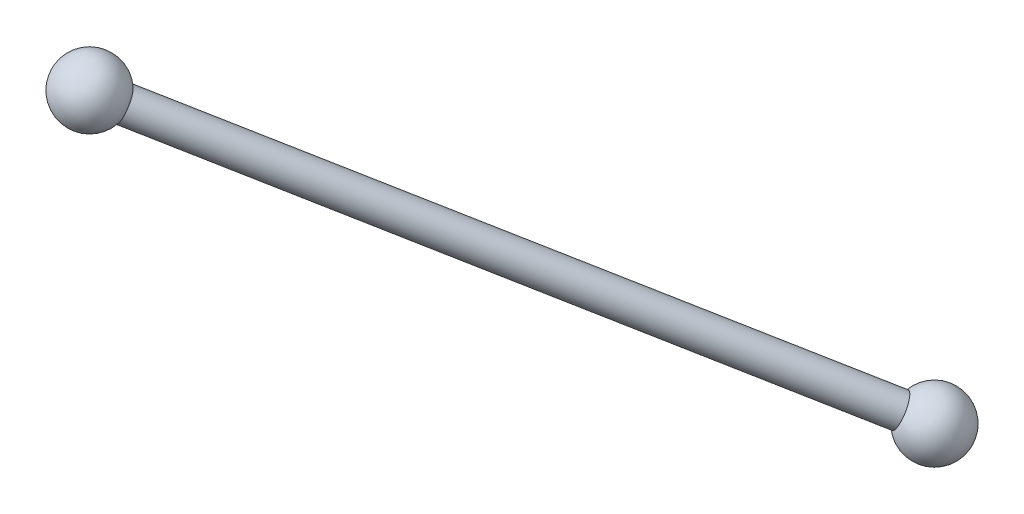
ISO-10303-21;
HEADER;
FILE_DESCRIPTION(('STEP AP214'),'2;1');
FILE_NAME('part.step','',(''),(''),'','','');
FILE_SCHEMA(('AUTOMOTIVE_DESIGN { 1 0 10303 214 1 1 1 1 }'));
ENDSEC;
DATA;
#1=APPLICATION_CONTEXT('core data for automotive mechanical design processes');
#2=APPLICATION_PROTOCOL_DEFINITION('international standard','automotive_design',2000,#1);
#3=PRODUCT_CONTEXT('',#1,'mechanical');
#4=PRODUCT('Part','Part','',(#3));
#5=PRODUCT_RELATED_PRODUCT_CATEGORY('part','',(#4));
#6=PRODUCT_DEFINITION_FORMATION('','',#4);
#7=PRODUCT_DEFINITION_CONTEXT('part definition',#1,'design');
#8=PRODUCT_DEFINITION('design','',#6,#7);
#9=PRODUCT_DEFINITION_SHAPE('','',#8);
#10=(LENGTH_UNIT() NAMED_UNIT(*) SI_UNIT(.MILLI.,.METRE.));
#11=(NAMED_UNIT(*) PLANE_ANGLE_UNIT() SI_UNIT($,.RADIAN.));
#12=(NAMED_UNIT(*) SI_UNIT($,.STERADIAN.) SOLID_ANGLE_UNIT());
#13=UNCERTAINTY_MEASURE_WITH_UNIT(LENGTH_MEASURE(1.E-05),#10,'distance_accuracy_value','');
#14=(GEOMETRIC_REPRESENTATION_CONTEXT(3) GLOBAL_UNCERTAINTY_ASSIGNED_CONTEXT((#13)) GLOBAL_UNIT_ASSIGNED_CONTEXT((#10,
#11,#12)) REPRESENTATION_CONTEXT('',''));
#15=CARTESIAN_POINT('',(0.,0.,0.));
#16=DIRECTION('',(0.,0.,1.));
#17=DIRECTION('',(1.,0.,0.));
#18=AXIS2_PLACEMENT_3D('',#15,#16,#17);
#19=CARTESIAN_POINT('',(-30.3108891325715,-101.00000000034,-14.9999999998891));
#20=DIRECTION('',(0.,0.,-1.));
#21=DIRECTION('',(-1.,0.,0.));
#22=AXIS2_PLACEMENT_3D('',#19,#20,#21);
#23=SPHERICAL_SURFACE('',#22,3.);
#24=CARTESIAN_POINT('',(-30.3108891325715,-101.00000000034,-14.9999999998891));
#25=DIRECTION('',(0.63669384291445,-0.435019425760953,-0.636693842914662));
#26=DIRECTION('',(-0.707106781186665,0.,-0.70710678118643));
#27=AXIS2_PLACEMENT_3D('',#24,#25,#26);
#28=SPHERICAL_SURFACE('',#27,3.);
#29=CARTESIAN_POINT('',(-31.9650682597627,-99.8697863787939,-13.3458208726975));
#30=DIRECTION('',(0.636693842914451,-0.435019425760953,-0.636693842914663));
#31=DIRECTION('',(-0.707106781186665,0.,-0.70710678118643));
#32=AXIS2_PLACEMENT_3D('',#29,#30,#31);
#33=CIRCLE('',#32,1.50000000000001);
#34=CARTESIAN_POINT('',(-33.0257284315427,-99.8697863787939,-14.4064810444771));
#35=VERTEX_POINT('',#34);
#36=EDGE_CURVE('E43',#35,#35,#33,.F.);
#37=ORIENTED_EDGE('',*,*,#36,.F.);
#38=EDGE_LOOP('',(#37));
#39=FACE_BOUND('',#38,.T.);
#40=ADVANCED_FACE('F39',(#39),#28,.T.);
#41=CARTESIAN_POINT('',(-71.29165124598,-73.,25.980762113533));
#42=DIRECTION('',(0.,0.,-1.));
#43=DIRECTION('',(-1.,0.,0.));
#44=AXIS2_PLACEMENT_3D('',#41,#42,#43);
#45=SPHERICAL_SURFACE('',#44,3.);
#46=CARTESIAN_POINT('',(-71.29165124598,-73.,25.980762113533));
#47=DIRECTION('',(-0.636693842914449,0.435019425760953,0.636693842914663));
#48=DIRECTION('',(0.707106781186666,0.,0.707106781186429));
#49=AXIS2_PLACEMENT_3D('',#46,#47,#48);
#50=SPHERICAL_SURFACE('',#49,3.);
#51=CARTESIAN_POINT('',(-69.6374721187888,-74.1302136215461,24.3265829863413));
#52=DIRECTION('',(-0.636693842914449,0.435019425760954,0.636693842914663));
#53=DIRECTION('',(0.707106781186666,0.,0.707106781186429));
#54=AXIS2_PLACEMENT_3D('',#51,#52,#53);
#55=CIRCLE('',#54,1.50000000000001);
#56=CARTESIAN_POINT('',(-68.5768119470088,-74.1302136215461,25.387243158121));
#57=VERTEX_POINT('',#56);
#58=EDGE_CURVE('E10',#57,#57,#55,.F.);
#59=ORIENTED_EDGE('',*,*,#58,.F.);
#60=EDGE_LOOP('',(#59));
#61=FACE_BOUND('',#60,.T.);
#62=ADVANCED_FACE('F53',(#61),#50,.T.);
#63=CARTESIAN_POINT('',(-30.3108891325715,-101.00000000034,-14.9999999998892));
#64=DIRECTION('',(-0.63669384291445,0.435019425760951,0.636693842914663));
#65=DIRECTION('',(0.707106781186666,0.,0.707106781186429));
#66=AXIS2_PLACEMENT_3D('',#63,#64,#65);
#67=CYLINDRICAL_SURFACE('',#66,1.50000000000001);
#68=ORIENTED_EDGE('',*,*,#36,.T.);
#69=EDGE_LOOP('',(#68));
#70=FACE_BOUND('',#69,.T.);
#71=ORIENTED_EDGE('',*,*,#58,.T.);
#72=EDGE_LOOP('',(#71));
#73=FACE_BOUND('',#72,.T.);
#74=ADVANCED_FACE('F41',(#70,#73),#67,.T.);
#75=CLOSED_SHELL('',(#40,#62,#74));
#76=MANIFOLD_SOLID_BREP('B2',#75);
#77=ADVANCED_BREP_SHAPE_REPRESENTATION('',(#18,#76),#14);
#78=SHAPE_DEFINITION_REPRESENTATION(#9,#77);
ENDSEC;
END-ISO-10303-21;
